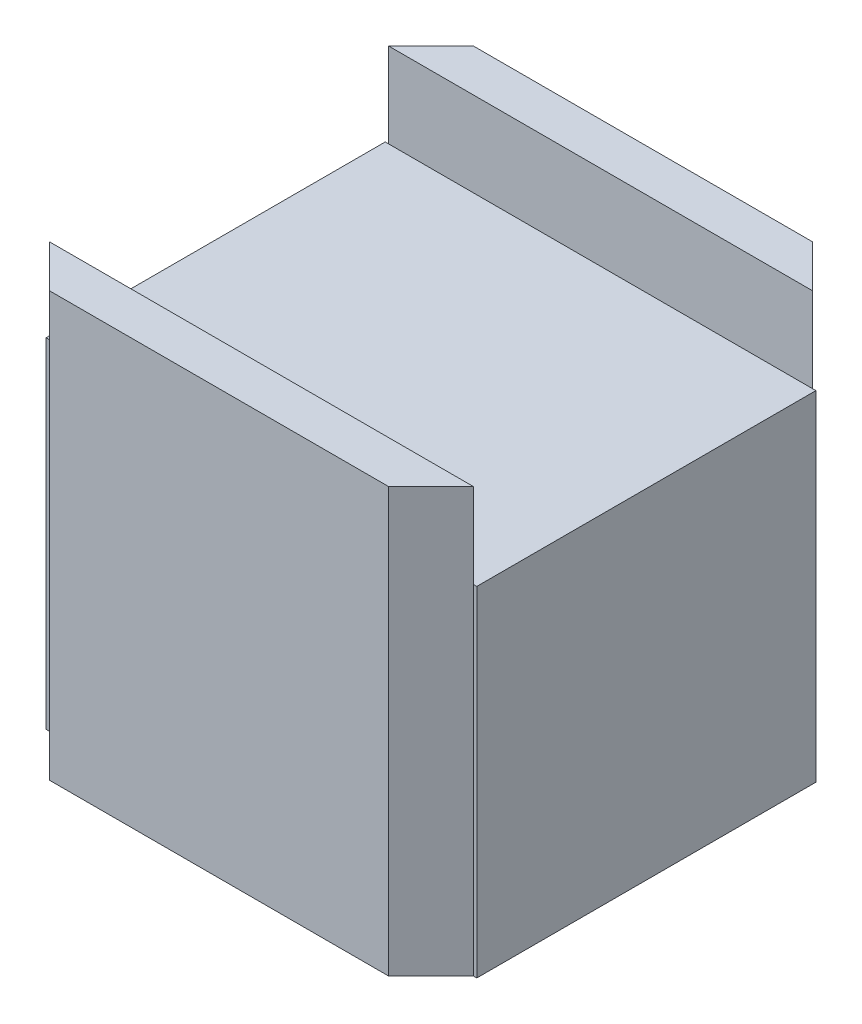
ISO-10303-21;
HEADER;
FILE_DESCRIPTION(('STEP AP214'),'2;1');
FILE_NAME('part.step','',(''),(''),'','','');
FILE_SCHEMA(('AUTOMOTIVE_DESIGN { 1 0 10303 214 1 1 1 1 }'));
ENDSEC;
DATA;
#1=APPLICATION_CONTEXT('core data for automotive mechanical design processes');
#2=APPLICATION_PROTOCOL_DEFINITION('international standard','automotive_design',2000,#1);
#3=PRODUCT_CONTEXT('',#1,'mechanical');
#4=PRODUCT('Part','Part','',(#3));
#5=PRODUCT_RELATED_PRODUCT_CATEGORY('part','',(#4));
#6=PRODUCT_DEFINITION_FORMATION('','',#4);
#7=PRODUCT_DEFINITION_CONTEXT('part definition',#1,'design');
#8=PRODUCT_DEFINITION('design','',#6,#7);
#9=PRODUCT_DEFINITION_SHAPE('','',#8);
#10=(LENGTH_UNIT() NAMED_UNIT(*) SI_UNIT(.MILLI.,.METRE.));
#11=(NAMED_UNIT(*) PLANE_ANGLE_UNIT() SI_UNIT($,.RADIAN.));
#12=(NAMED_UNIT(*) SI_UNIT($,.STERADIAN.) SOLID_ANGLE_UNIT());
#13=UNCERTAINTY_MEASURE_WITH_UNIT(LENGTH_MEASURE(1.E-05),#10,'distance_accuracy_value','');
#14=(GEOMETRIC_REPRESENTATION_CONTEXT(3) GLOBAL_UNCERTAINTY_ASSIGNED_CONTEXT((#13)) GLOBAL_UNIT_ASSIGNED_CONTEXT((#10,
#11,#12)) REPRESENTATION_CONTEXT('',''));
#15=CARTESIAN_POINT('',(0.,0.,0.));
#16=DIRECTION('',(0.,0.,1.));
#17=DIRECTION('',(1.,0.,0.));
#18=AXIS2_PLACEMENT_3D('',#15,#16,#17);
#19=CARTESIAN_POINT('',(0.,2.5,0.));
#20=DIRECTION('',(0.,1.,0.));
#21=DIRECTION('',(0.,0.,1.));
#22=AXIS2_PLACEMENT_3D('',#19,#20,#21);
#23=PLANE('',#22);
#24=DIRECTION('',(1.,0.,0.));
#25=VECTOR('',#24,1.);
#26=CARTESIAN_POINT('',(0.,2.5,1.));
#27=LINE('',#26,#25);
#28=CARTESIAN_POINT('',(-1.25,2.5,1.));
#29=VERTEX_POINT('',#28);
#30=CARTESIAN_POINT('',(1.25,2.5,1.));
#31=VERTEX_POINT('',#30);
#32=EDGE_CURVE('E11',#29,#31,#27,.T.);
#33=ORIENTED_EDGE('',*,*,#32,.F.);
#34=DIRECTION('',(0.707106781186547,0.,0.707106781186548));
#35=VECTOR('',#34,1.);
#36=CARTESIAN_POINT('',(-1.125,2.5,1.125));
#37=LINE('',#36,#35);
#38=CARTESIAN_POINT('',(-1.,2.5,1.25));
#39=VERTEX_POINT('',#38);
#40=EDGE_CURVE('E114',#29,#39,#37,.T.);
#41=ORIENTED_EDGE('',*,*,#40,.T.);
#42=DIRECTION('',(1.,0.,0.));
#43=VECTOR('',#42,1.);
#44=CARTESIAN_POINT('',(0.,2.5,1.25));
#45=LINE('',#44,#43);
#46=CARTESIAN_POINT('',(1.,2.5,1.25));
#47=VERTEX_POINT('',#46);
#48=EDGE_CURVE('E155',#39,#47,#45,.T.);
#49=ORIENTED_EDGE('',*,*,#48,.T.);
#50=DIRECTION('',(0.707106781186548,0.,-0.707106781186548));
#51=VECTOR('',#50,1.);
#52=CARTESIAN_POINT('',(1.125,2.5,1.125));
#53=LINE('',#52,#51);
#54=EDGE_CURVE('E151',#47,#31,#53,.T.);
#55=ORIENTED_EDGE('',*,*,#54,.T.);
#56=EDGE_LOOP('',(#33,#41,#49,#55));
#57=FACE_BOUND('',#56,.T.);
#58=ADVANCED_FACE('F38',(#57),#23,.T.);
#59=CARTESIAN_POINT('',(-1.27,2.5,0.));
#60=DIRECTION('',(1.,0.,0.));
#61=DIRECTION('',(0.,0.,-1.));
#62=AXIS2_PLACEMENT_3D('',#59,#60,#61);
#63=PLANE('',#62);
#64=DIRECTION('',(0.,-1.,0.));
#65=VECTOR('',#64,1.);
#66=CARTESIAN_POINT('',(-1.27,2.5,1.));
#67=LINE('',#66,#65);
#68=CARTESIAN_POINT('',(-1.27,2.,1.));
#69=VERTEX_POINT('',#68);
#70=CARTESIAN_POINT('',(-1.27,0.,1.));
#71=VERTEX_POINT('',#70);
#72=EDGE_CURVE('E146',#69,#71,#67,.T.);
#73=ORIENTED_EDGE('',*,*,#72,.F.);
#74=DIRECTION('',(0.,0.,1.));
#75=VECTOR('',#74,1.);
#76=CARTESIAN_POINT('',(-1.27,2.,1.));
#77=LINE('',#76,#75);
#78=CARTESIAN_POINT('',(-1.27,2.,-1.));
#79=VERTEX_POINT('',#78);
#80=EDGE_CURVE('E329',#79,#69,#77,.T.);
#81=ORIENTED_EDGE('',*,*,#80,.F.);
#82=DIRECTION('',(0.,-1.,0.));
#83=VECTOR('',#82,1.);
#84=CARTESIAN_POINT('',(-1.27,2.5,-1.));
#85=LINE('',#84,#83);
#86=CARTESIAN_POINT('',(-1.27,0.,-1.));
#87=VERTEX_POINT('',#86);
#88=EDGE_CURVE('E105',#79,#87,#85,.T.);
#89=ORIENTED_EDGE('',*,*,#88,.T.);
#90=DIRECTION('',(0.,0.,1.));
#91=VECTOR('',#90,1.);
#92=CARTESIAN_POINT('',(-1.27,0.,0.));
#93=LINE('',#92,#91);
#94=EDGE_CURVE('E160',#87,#71,#93,.T.);
#95=ORIENTED_EDGE('',*,*,#94,.T.);
#96=EDGE_LOOP('',(#73,#81,#89,#95));
#97=FACE_BOUND('',#96,.T.);
#98=ADVANCED_FACE('F40',(#97),#63,.F.);
#99=CARTESIAN_POINT('',(0.,2.5,1.));
#100=DIRECTION('',(0.,0.,-1.));
#101=DIRECTION('',(-1.,0.,0.));
#102=AXIS2_PLACEMENT_3D('',#99,#100,#101);
#103=PLANE('',#102);
#104=DIRECTION('',(0.,-1.,0.));
#105=VECTOR('',#104,1.);
#106=CARTESIAN_POINT('',(-1.25,2.5,1.));
#107=LINE('',#106,#105);
#108=CARTESIAN_POINT('',(-1.25,2.,1.));
#109=VERTEX_POINT('',#108);
#110=CARTESIAN_POINT('',(-1.25,0.,1.));
#111=VERTEX_POINT('',#110);
#112=EDGE_CURVE('E212',#109,#111,#107,.T.);
#113=ORIENTED_EDGE('',*,*,#112,.F.);
#114=DIRECTION('',(1.,0.,0.));
#115=VECTOR('',#114,1.);
#116=CARTESIAN_POINT('',(-1.27,2.,1.));
#117=LINE('',#116,#115);
#118=EDGE_CURVE('E163',#69,#109,#117,.T.);
#119=ORIENTED_EDGE('',*,*,#118,.F.);
#120=ORIENTED_EDGE('',*,*,#72,.T.);
#121=DIRECTION('',(1.,0.,0.));
#122=VECTOR('',#121,1.);
#123=CARTESIAN_POINT('',(0.,0.,1.));
#124=LINE('',#123,#122);
#125=EDGE_CURVE('E162',#71,#111,#124,.T.);
#126=ORIENTED_EDGE('',*,*,#125,.T.);
#127=EDGE_LOOP('',(#113,#119,#120,#126));
#128=FACE_BOUND('',#127,.T.);
#129=ADVANCED_FACE('F221',(#128),#103,.F.);
#130=CARTESIAN_POINT('',(-1.125,2.5,1.125));
#131=DIRECTION('',(0.707106781186548,0.,-0.707106781186547));
#132=DIRECTION('',(-0.707106781186547,0.,-0.707106781186548));
#133=AXIS2_PLACEMENT_3D('',#130,#131,#132);
#134=PLANE('',#133);
#135=DIRECTION('',(0.707106781186547,0.,0.707106781186548));
#136=VECTOR('',#135,1.);
#137=CARTESIAN_POINT('',(-1.125,0.,1.125));
#138=LINE('',#137,#136);
#139=CARTESIAN_POINT('',(-1.,0.,1.25));
#140=VERTEX_POINT('',#139);
#141=EDGE_CURVE('E166',#111,#140,#138,.T.);
#142=ORIENTED_EDGE('',*,*,#141,.T.);
#143=DIRECTION('',(0.,-1.,0.));
#144=VECTOR('',#143,1.);
#145=CARTESIAN_POINT('',(-1.,2.5,1.25));
#146=LINE('',#145,#144);
#147=EDGE_CURVE('E209',#39,#140,#146,.T.);
#148=ORIENTED_EDGE('',*,*,#147,.F.);
#149=ORIENTED_EDGE('',*,*,#40,.F.);
#150=EDGE_CURVE('E213',#29,#109,#107,.T.);
#151=ORIENTED_EDGE('',*,*,#150,.T.);
#152=ORIENTED_EDGE('',*,*,#112,.T.);
#153=EDGE_LOOP('',(#142,#148,#149,#151,#152));
#154=FACE_BOUND('',#153,.T.);
#155=ADVANCED_FACE('F233',(#154),#134,.F.);
#156=CARTESIAN_POINT('',(0.,2.5,1.25));
#157=DIRECTION('',(0.,0.,-1.));
#158=DIRECTION('',(-1.,0.,0.));
#159=AXIS2_PLACEMENT_3D('',#156,#157,#158);
#160=PLANE('',#159);
#161=DIRECTION('',(1.,0.,0.));
#162=VECTOR('',#161,1.);
#163=CARTESIAN_POINT('',(0.,0.,1.25));
#164=LINE('',#163,#162);
#165=CARTESIAN_POINT('',(1.,0.,1.25));
#166=VERTEX_POINT('',#165);
#167=EDGE_CURVE('E168',#140,#166,#164,.T.);
#168=ORIENTED_EDGE('',*,*,#167,.T.);
#169=DIRECTION('',(0.,-1.,0.));
#170=VECTOR('',#169,1.);
#171=CARTESIAN_POINT('',(1.,2.5,1.25));
#172=LINE('',#171,#170);
#173=EDGE_CURVE('E206',#47,#166,#172,.T.);
#174=ORIENTED_EDGE('',*,*,#173,.F.);
#175=ORIENTED_EDGE('',*,*,#48,.F.);
#176=ORIENTED_EDGE('',*,*,#147,.T.);
#177=EDGE_LOOP('',(#168,#174,#175,#176));
#178=FACE_BOUND('',#177,.T.);
#179=ADVANCED_FACE('F274',(#178),#160,.F.);
#180=CARTESIAN_POINT('',(1.125,2.5,1.125));
#181=DIRECTION('',(-0.707106781186548,0.,-0.707106781186548));
#182=DIRECTION('',(-0.707106781186548,0.,0.707106781186548));
#183=AXIS2_PLACEMENT_3D('',#180,#181,#182);
#184=PLANE('',#183);
#185=DIRECTION('',(0.707106781186548,0.,-0.707106781186548));
#186=VECTOR('',#185,1.);
#187=CARTESIAN_POINT('',(1.125,0.,1.125));
#188=LINE('',#187,#186);
#189=CARTESIAN_POINT('',(1.25,0.,1.));
#190=VERTEX_POINT('',#189);
#191=EDGE_CURVE('E170',#166,#190,#188,.T.);
#192=ORIENTED_EDGE('',*,*,#191,.T.);
#193=DIRECTION('',(0.,-1.,0.));
#194=VECTOR('',#193,1.);
#195=CARTESIAN_POINT('',(1.25,2.5,1.));
#196=LINE('',#195,#194);
#197=CARTESIAN_POINT('',(1.25,2.,1.));
#198=VERTEX_POINT('',#197);
#199=EDGE_CURVE('E202',#198,#190,#196,.T.);
#200=ORIENTED_EDGE('',*,*,#199,.F.);
#201=EDGE_CURVE('E203',#31,#198,#196,.T.);
#202=ORIENTED_EDGE('',*,*,#201,.F.);
#203=ORIENTED_EDGE('',*,*,#54,.F.);
#204=ORIENTED_EDGE('',*,*,#173,.T.);
#205=EDGE_LOOP('',(#192,#200,#202,#203,#204));
#206=FACE_BOUND('',#205,.T.);
#207=ADVANCED_FACE('F270',(#206),#184,.F.);
#208=CARTESIAN_POINT('',(0.,2.5,1.));
#209=DIRECTION('',(0.,0.,-1.));
#210=DIRECTION('',(-1.,0.,0.));
#211=AXIS2_PLACEMENT_3D('',#208,#209,#210);
#212=PLANE('',#211);
#213=DIRECTION('',(0.,-1.,0.));
#214=VECTOR('',#213,1.);
#215=CARTESIAN_POINT('',(1.27,2.5,1.));
#216=LINE('',#215,#214);
#217=CARTESIAN_POINT('',(1.27,2.,1.));
#218=VERTEX_POINT('',#217);
#219=CARTESIAN_POINT('',(1.27,0.,1.));
#220=VERTEX_POINT('',#219);
#221=EDGE_CURVE('E200',#218,#220,#216,.T.);
#222=ORIENTED_EDGE('',*,*,#221,.F.);
#223=EDGE_CURVE('E322',#198,#218,#117,.T.);
#224=ORIENTED_EDGE('',*,*,#223,.F.);
#225=ORIENTED_EDGE('',*,*,#199,.T.);
#226=DIRECTION('',(1.,0.,0.));
#227=VECTOR('',#226,1.);
#228=CARTESIAN_POINT('',(0.,0.,1.));
#229=LINE('',#228,#227);
#230=EDGE_CURVE('E173',#190,#220,#229,.T.);
#231=ORIENTED_EDGE('',*,*,#230,.T.);
#232=EDGE_LOOP('',(#222,#224,#225,#231));
#233=FACE_BOUND('',#232,.T.);
#234=ADVANCED_FACE('F266',(#233),#212,.F.);
#235=CARTESIAN_POINT('',(1.27,2.5,0.));
#236=DIRECTION('',(1.,0.,0.));
#237=DIRECTION('',(0.,0.,-1.));
#238=AXIS2_PLACEMENT_3D('',#235,#236,#237);
#239=PLANE('',#238);
#240=DIRECTION('',(0.,0.,-1.));
#241=VECTOR('',#240,1.);
#242=CARTESIAN_POINT('',(1.27,2.,1.));
#243=LINE('',#242,#241);
#244=CARTESIAN_POINT('',(1.27,2.,-1.));
#245=VERTEX_POINT('',#244);
#246=EDGE_CURVE('E315',#218,#245,#243,.T.);
#247=ORIENTED_EDGE('',*,*,#246,.F.);
#248=ORIENTED_EDGE('',*,*,#221,.T.);
#249=DIRECTION('',(0.,0.,1.));
#250=VECTOR('',#249,1.);
#251=CARTESIAN_POINT('',(1.27,0.,0.));
#252=LINE('',#251,#250);
#253=CARTESIAN_POINT('',(1.27,0.,-1.));
#254=VERTEX_POINT('',#253);
#255=EDGE_CURVE('E176',#254,#220,#252,.T.);
#256=ORIENTED_EDGE('',*,*,#255,.F.);
#257=DIRECTION('',(0.,-1.,0.));
#258=VECTOR('',#257,1.);
#259=CARTESIAN_POINT('',(1.27,2.5,-1.));
#260=LINE('',#259,#258);
#261=EDGE_CURVE('E136',#245,#254,#260,.T.);
#262=ORIENTED_EDGE('',*,*,#261,.F.);
#263=EDGE_LOOP('',(#247,#248,#256,#262));
#264=FACE_BOUND('',#263,.T.);
#265=ADVANCED_FACE('F262',(#264),#239,.T.);
#266=CARTESIAN_POINT('',(0.,2.5,-1.));
#267=DIRECTION('',(0.,0.,-1.));
#268=DIRECTION('',(-1.,0.,0.));
#269=AXIS2_PLACEMENT_3D('',#266,#267,#268);
#270=PLANE('',#269);
#271=DIRECTION('',(-1.,0.,0.));
#272=VECTOR('',#271,1.);
#273=CARTESIAN_POINT('',(-1.27,2.,-1.));
#274=LINE('',#273,#272);
#275=CARTESIAN_POINT('',(1.25,2.,-1.));
#276=VERTEX_POINT('',#275);
#277=EDGE_CURVE('E318',#245,#276,#274,.T.);
#278=ORIENTED_EDGE('',*,*,#277,.F.);
#279=ORIENTED_EDGE('',*,*,#261,.T.);
#280=DIRECTION('',(1.,0.,0.));
#281=VECTOR('',#280,1.);
#282=CARTESIAN_POINT('',(0.,0.,-1.));
#283=LINE('',#282,#281);
#284=CARTESIAN_POINT('',(1.25,0.,-1.));
#285=VERTEX_POINT('',#284);
#286=EDGE_CURVE('E179',#285,#254,#283,.T.);
#287=ORIENTED_EDGE('',*,*,#286,.F.);
#288=DIRECTION('',(0.,-1.,0.));
#289=VECTOR('',#288,1.);
#290=CARTESIAN_POINT('',(1.25,2.5,-1.));
#291=LINE('',#290,#289);
#292=EDGE_CURVE('E137',#276,#285,#291,.T.);
#293=ORIENTED_EDGE('',*,*,#292,.F.);
#294=EDGE_LOOP('',(#278,#279,#287,#293));
#295=FACE_BOUND('',#294,.T.);
#296=ADVANCED_FACE('F259',(#295),#270,.T.);
#297=CARTESIAN_POINT('',(1.125,2.5,-1.125));
#298=DIRECTION('',(0.707106781186548,0.,-0.707106781186548));
#299=DIRECTION('',(-0.707106781186548,0.,-0.707106781186548));
#300=AXIS2_PLACEMENT_3D('',#297,#298,#299);
#301=PLANE('',#300);
#302=DIRECTION('',(0.707106781186548,0.,0.707106781186548));
#303=VECTOR('',#302,1.);
#304=CARTESIAN_POINT('',(1.125,0.,-1.125));
#305=LINE('',#304,#303);
#306=CARTESIAN_POINT('',(1.,0.,-1.25));
#307=VERTEX_POINT('',#306);
#308=EDGE_CURVE('E182',#307,#285,#305,.T.);
#309=ORIENTED_EDGE('',*,*,#308,.F.);
#310=DIRECTION('',(0.,-1.,0.));
#311=VECTOR('',#310,1.);
#312=CARTESIAN_POINT('',(1.,2.5,-1.25));
#313=LINE('',#312,#311);
#314=CARTESIAN_POINT('',(1.,2.5,-1.25));
#315=VERTEX_POINT('',#314);
#316=EDGE_CURVE('E149',#315,#307,#313,.T.);
#317=ORIENTED_EDGE('',*,*,#316,.F.);
#318=DIRECTION('',(0.707106781186548,0.,0.707106781186548));
#319=VECTOR('',#318,1.);
#320=CARTESIAN_POINT('',(1.125,2.5,-1.125));
#321=LINE('',#320,#319);
#322=CARTESIAN_POINT('',(1.25,2.5,-1.));
#323=VERTEX_POINT('',#322);
#324=EDGE_CURVE('E143',#315,#323,#321,.T.);
#325=ORIENTED_EDGE('',*,*,#324,.T.);
#326=EDGE_CURVE('E124',#323,#276,#291,.T.);
#327=ORIENTED_EDGE('',*,*,#326,.T.);
#328=ORIENTED_EDGE('',*,*,#292,.T.);
#329=EDGE_LOOP('',(#309,#317,#325,#327,#328));
#330=FACE_BOUND('',#329,.T.);
#331=ADVANCED_FACE('F148',(#330),#301,.T.);
#332=CARTESIAN_POINT('',(0.,2.5,-1.25));
#333=DIRECTION('',(0.,0.,-1.));
#334=DIRECTION('',(-1.,0.,0.));
#335=AXIS2_PLACEMENT_3D('',#332,#333,#334);
#336=PLANE('',#335);
#337=DIRECTION('',(1.,0.,0.));
#338=VECTOR('',#337,1.);
#339=CARTESIAN_POINT('',(0.,0.,-1.25));
#340=LINE('',#339,#338);
#341=CARTESIAN_POINT('',(-1.,0.,-1.25));
#342=VERTEX_POINT('',#341);
#343=EDGE_CURVE('E185',#342,#307,#340,.T.);
#344=ORIENTED_EDGE('',*,*,#343,.F.);
#345=DIRECTION('',(0.,-1.,0.));
#346=VECTOR('',#345,1.);
#347=CARTESIAN_POINT('',(-1.,2.5,-1.25));
#348=LINE('',#347,#346);
#349=CARTESIAN_POINT('',(-1.,2.5,-1.25));
#350=VERTEX_POINT('',#349);
#351=EDGE_CURVE('E55',#350,#342,#348,.T.);
#352=ORIENTED_EDGE('',*,*,#351,.F.);
#353=DIRECTION('',(1.,0.,0.));
#354=VECTOR('',#353,1.);
#355=CARTESIAN_POINT('',(0.,2.5,-1.25));
#356=LINE('',#355,#354);
#357=EDGE_CURVE('E150',#350,#315,#356,.T.);
#358=ORIENTED_EDGE('',*,*,#357,.T.);
#359=ORIENTED_EDGE('',*,*,#316,.T.);
#360=EDGE_LOOP('',(#344,#352,#358,#359));
#361=FACE_BOUND('',#360,.T.);
#362=ADVANCED_FACE('F251',(#361),#336,.T.);
#363=CARTESIAN_POINT('',(-1.125,2.5,-1.125));
#364=DIRECTION('',(-0.707106781186548,0.,-0.707106781186548));
#365=DIRECTION('',(-0.707106781186548,0.,0.707106781186548));
#366=AXIS2_PLACEMENT_3D('',#363,#364,#365);
#367=PLANE('',#366);
#368=DIRECTION('',(0.707106781186548,0.,-0.707106781186548));
#369=VECTOR('',#368,1.);
#370=CARTESIAN_POINT('',(-1.125,0.,-1.125));
#371=LINE('',#370,#369);
#372=CARTESIAN_POINT('',(-1.25,0.,-1.));
#373=VERTEX_POINT('',#372);
#374=EDGE_CURVE('E188',#373,#342,#371,.T.);
#375=ORIENTED_EDGE('',*,*,#374,.F.);
#376=DIRECTION('',(0.,-1.,0.));
#377=VECTOR('',#376,1.);
#378=CARTESIAN_POINT('',(-1.25,2.5,-1.));
#379=LINE('',#378,#377);
#380=CARTESIAN_POINT('',(-1.25,2.,-1.));
#381=VERTEX_POINT('',#380);
#382=EDGE_CURVE('E97',#381,#373,#379,.T.);
#383=ORIENTED_EDGE('',*,*,#382,.F.);
#384=CARTESIAN_POINT('',(-1.25,2.5,-1.));
#385=VERTEX_POINT('',#384);
#386=EDGE_CURVE('E195',#385,#381,#379,.T.);
#387=ORIENTED_EDGE('',*,*,#386,.F.);
#388=DIRECTION('',(0.707106781186548,0.,-0.707106781186548));
#389=VECTOR('',#388,1.);
#390=CARTESIAN_POINT('',(-1.125,2.5,-1.125));
#391=LINE('',#390,#389);
#392=EDGE_CURVE('E145',#385,#350,#391,.T.);
#393=ORIENTED_EDGE('',*,*,#392,.T.);
#394=ORIENTED_EDGE('',*,*,#351,.T.);
#395=EDGE_LOOP('',(#375,#383,#387,#393,#394));
#396=FACE_BOUND('',#395,.T.);
#397=ADVANCED_FACE('F246',(#396),#367,.T.);
#398=CARTESIAN_POINT('',(0.,2.5,-1.));
#399=DIRECTION('',(0.,0.,-1.));
#400=DIRECTION('',(-1.,0.,0.));
#401=AXIS2_PLACEMENT_3D('',#398,#399,#400);
#402=PLANE('',#401);
#403=EDGE_CURVE('E325',#381,#79,#274,.T.);
#404=ORIENTED_EDGE('',*,*,#403,.F.);
#405=ORIENTED_EDGE('',*,*,#382,.T.);
#406=DIRECTION('',(1.,0.,0.));
#407=VECTOR('',#406,1.);
#408=CARTESIAN_POINT('',(0.,0.,-1.));
#409=LINE('',#408,#407);
#410=EDGE_CURVE('E191',#87,#373,#409,.T.);
#411=ORIENTED_EDGE('',*,*,#410,.F.);
#412=ORIENTED_EDGE('',*,*,#88,.F.);
#413=EDGE_LOOP('',(#404,#405,#411,#412));
#414=FACE_BOUND('',#413,.T.);
#415=ADVANCED_FACE('F240',(#414),#402,.T.);
#416=DIRECTION('',(-1.,0.,0.));
#417=VECTOR('',#416,1.);
#418=CARTESIAN_POINT('',(0.,2.5,-1.));
#419=LINE('',#418,#417);
#420=EDGE_CURVE('E47',#323,#385,#419,.T.);
#421=ORIENTED_EDGE('',*,*,#420,.F.);
#422=ORIENTED_EDGE('',*,*,#324,.F.);
#423=ORIENTED_EDGE('',*,*,#357,.F.);
#424=ORIENTED_EDGE('',*,*,#392,.F.);
#425=EDGE_LOOP('',(#421,#422,#423,#424));
#426=FACE_BOUND('',#425,.T.);
#427=ADVANCED_FACE('F142',(#426),#23,.T.);
#428=CARTESIAN_POINT('',(0.,0.,0.));
#429=DIRECTION('',(0.,1.,0.));
#430=DIRECTION('',(0.,0.,1.));
#431=AXIS2_PLACEMENT_3D('',#428,#429,#430);
#432=PLANE('',#431);
#433=ORIENTED_EDGE('',*,*,#94,.F.);
#434=ORIENTED_EDGE('',*,*,#410,.T.);
#435=ORIENTED_EDGE('',*,*,#374,.T.);
#436=ORIENTED_EDGE('',*,*,#343,.T.);
#437=ORIENTED_EDGE('',*,*,#308,.T.);
#438=ORIENTED_EDGE('',*,*,#286,.T.);
#439=ORIENTED_EDGE('',*,*,#255,.T.);
#440=ORIENTED_EDGE('',*,*,#230,.F.);
#441=ORIENTED_EDGE('',*,*,#191,.F.);
#442=ORIENTED_EDGE('',*,*,#167,.F.);
#443=ORIENTED_EDGE('',*,*,#141,.F.);
#444=ORIENTED_EDGE('',*,*,#125,.F.);
#445=EDGE_LOOP('',(#433,#434,#435,#436,#437,#438,#439,#440,#441,#442,#443,#444));
#446=FACE_BOUND('',#445,.T.);
#447=ADVANCED_FACE('F226',(#446),#432,.F.);
#448=CARTESIAN_POINT('',(-1.27,2.,1.));
#449=DIRECTION('',(0.,0.,1.));
#450=DIRECTION('',(1.,0.,0.));
#451=AXIS2_PLACEMENT_3D('',#448,#449,#450);
#452=PLANE('',#451);
#453=ORIENTED_EDGE('',*,*,#32,.T.);
#454=ORIENTED_EDGE('',*,*,#201,.T.);
#455=EDGE_CURVE('E334',#109,#198,#117,.T.);
#456=ORIENTED_EDGE('',*,*,#455,.F.);
#457=ORIENTED_EDGE('',*,*,#150,.F.);
#458=EDGE_LOOP('',(#453,#454,#456,#457));
#459=FACE_BOUND('',#458,.T.);
#460=ADVANCED_FACE('F245',(#459),#452,.F.);
#461=CARTESIAN_POINT('',(-1.27,2.,-1.));
#462=DIRECTION('',(0.,0.,-1.));
#463=DIRECTION('',(-1.,0.,0.));
#464=AXIS2_PLACEMENT_3D('',#461,#462,#463);
#465=PLANE('',#464);
#466=ORIENTED_EDGE('',*,*,#326,.F.);
#467=ORIENTED_EDGE('',*,*,#420,.T.);
#468=ORIENTED_EDGE('',*,*,#386,.T.);
#469=EDGE_CURVE('E132',#276,#381,#274,.T.);
#470=ORIENTED_EDGE('',*,*,#469,.F.);
#471=EDGE_LOOP('',(#466,#467,#468,#470));
#472=FACE_BOUND('',#471,.T.);
#473=ADVANCED_FACE('F126',(#472),#465,.F.);
#474=CARTESIAN_POINT('',(0.,2.,0.));
#475=DIRECTION('',(0.,-1.,0.));
#476=DIRECTION('',(0.,0.,-1.));
#477=AXIS2_PLACEMENT_3D('',#474,#475,#476);
#478=PLANE('',#477);
#479=ORIENTED_EDGE('',*,*,#246,.T.);
#480=ORIENTED_EDGE('',*,*,#277,.T.);
#481=ORIENTED_EDGE('',*,*,#469,.T.);
#482=ORIENTED_EDGE('',*,*,#403,.T.);
#483=ORIENTED_EDGE('',*,*,#80,.T.);
#484=ORIENTED_EDGE('',*,*,#118,.T.);
#485=ORIENTED_EDGE('',*,*,#455,.T.);
#486=ORIENTED_EDGE('',*,*,#223,.T.);
#487=EDGE_LOOP('',(#479,#480,#481,#482,#483,#484,#485,#486));
#488=FACE_BOUND('',#487,.T.);
#489=ADVANCED_FACE('F317',(#488),#478,.F.);
#490=CLOSED_SHELL('',(#58,#98,#129,#155,#179,#207,#234,#265,#296,#331,#362,#397,#415,#427,#447,
#460,#473,#489));
#491=MANIFOLD_SOLID_BREP('B2',#490);
#492=ADVANCED_BREP_SHAPE_REPRESENTATION('',(#18,#491),#14);
#493=SHAPE_DEFINITION_REPRESENTATION(#9,#492);
ENDSEC;
END-ISO-10303-21;
